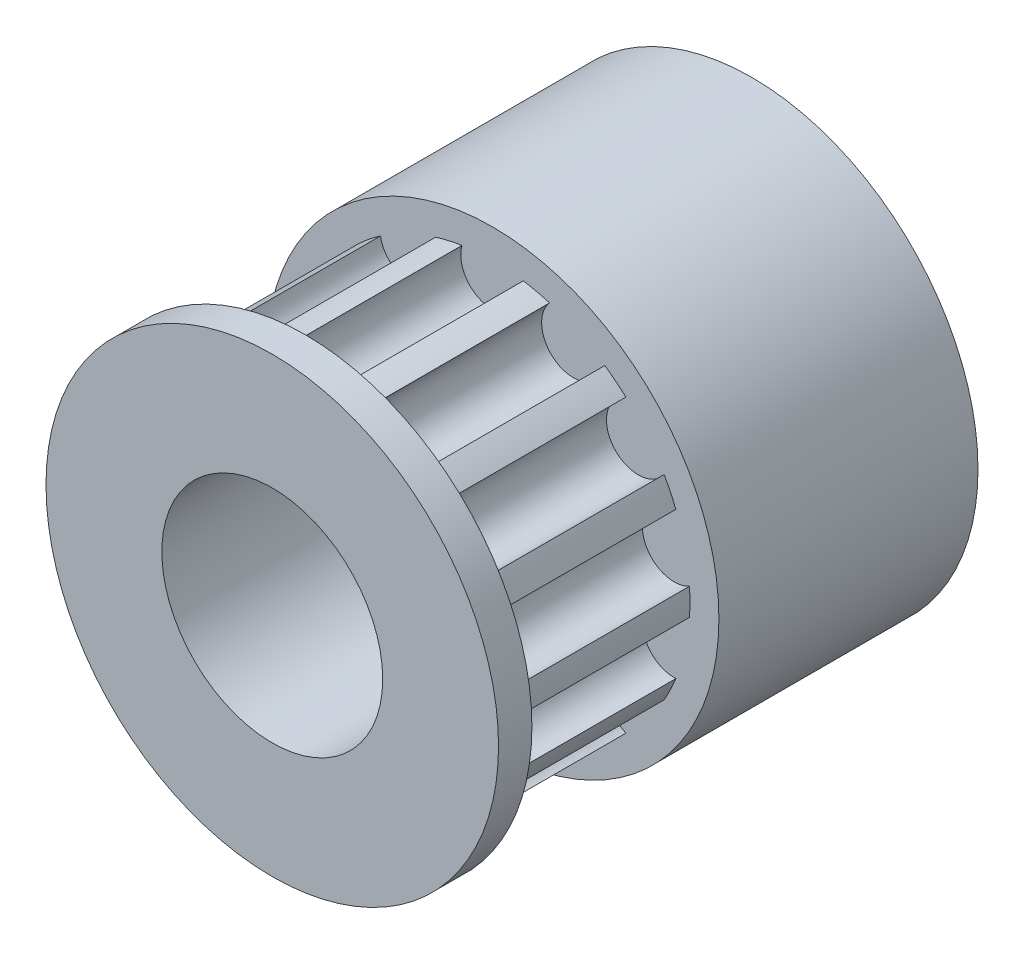
ISO-10303-21;
HEADER;
FILE_DESCRIPTION(('STEP AP214'),'2;1');
FILE_NAME('part.step','',(''),(''),'','','');
FILE_SCHEMA(('AUTOMOTIVE_DESIGN { 1 0 10303 214 1 1 1 1 }'));
ENDSEC;
DATA;
#1=APPLICATION_CONTEXT('core data for automotive mechanical design processes');
#2=APPLICATION_PROTOCOL_DEFINITION('international standard','automotive_design',2000,#1);
#3=PRODUCT_CONTEXT('',#1,'mechanical');
#4=PRODUCT('Part','Part','',(#3));
#5=PRODUCT_RELATED_PRODUCT_CATEGORY('part','',(#4));
#6=PRODUCT_DEFINITION_FORMATION('','',#4);
#7=PRODUCT_DEFINITION_CONTEXT('part definition',#1,'design');
#8=PRODUCT_DEFINITION('design','',#6,#7);
#9=PRODUCT_DEFINITION_SHAPE('','',#8);
#10=(LENGTH_UNIT() NAMED_UNIT(*) SI_UNIT(.MILLI.,.METRE.));
#11=(NAMED_UNIT(*) PLANE_ANGLE_UNIT() SI_UNIT($,.RADIAN.));
#12=(NAMED_UNIT(*) SI_UNIT($,.STERADIAN.) SOLID_ANGLE_UNIT());
#13=UNCERTAINTY_MEASURE_WITH_UNIT(LENGTH_MEASURE(1.E-05),#10,'distance_accuracy_value','');
#14=(GEOMETRIC_REPRESENTATION_CONTEXT(3) GLOBAL_UNCERTAINTY_ASSIGNED_CONTEXT((#13)) GLOBAL_UNIT_ASSIGNED_CONTEXT((#10,
#11,#12)) REPRESENTATION_CONTEXT('',''));
#15=CARTESIAN_POINT('',(0.,0.,0.));
#16=DIRECTION('',(0.,0.,1.));
#17=DIRECTION('',(1.,0.,0.));
#18=AXIS2_PLACEMENT_3D('',#15,#16,#17);
#19=CARTESIAN_POINT('',(0.,0.,0.));
#20=DIRECTION('',(0.,0.,1.));
#21=DIRECTION('',(1.,0.,0.));
#22=AXIS2_PLACEMENT_3D('',#19,#20,#21);
#23=CYLINDRICAL_SURFACE('',#22,3.40712276511129);
#24=DIRECTION('',(0.,0.,-1.));
#25=VECTOR('',#24,1.);
#26=CARTESIAN_POINT('',(0.983226332800047,3.26216975570355,0.876259982452928));
#27=LINE('',#26,#25);
#28=CARTESIAN_POINT('',(0.983226332800176,3.26216975570369,-0.576062561708139));
#29=VERTEX_POINT('',#28);
#30=CARTESIAN_POINT('',(0.983226332800047,3.26216975570355,-3.8052544946655));
#31=VERTEX_POINT('',#30);
#32=EDGE_CURVE('E364',#29,#31,#27,.T.);
#33=ORIENTED_EDGE('',*,*,#32,.T.);
#34=CARTESIAN_POINT('',(0.,0.,-3.8052544946655));
#35=DIRECTION('',(0.,0.,1.));
#36=DIRECTION('',(1.,0.,0.));
#37=AXIS2_PLACEMENT_3D('',#34,#35,#36);
#38=CIRCLE('',#37,3.40712276511129);
#39=CARTESIAN_POINT('',(0.529546095285646,3.36571930937596,-3.8052544946655));
#40=VERTEX_POINT('',#39);
#41=EDGE_CURVE('E333',#31,#40,#38,.T.);
#42=ORIENTED_EDGE('',*,*,#41,.T.);
#43=DIRECTION('',(0.,0.,-1.));
#44=VECTOR('',#43,1.);
#45=CARTESIAN_POINT('',(0.529546095285646,3.36571930937596,0.876259982452928));
#46=LINE('',#45,#44);
#47=CARTESIAN_POINT('',(0.529546095285646,3.36571930937596,-0.576062561708139));
#48=VERTEX_POINT('',#47);
#49=EDGE_CURVE('E259',#48,#40,#46,.T.);
#50=ORIENTED_EDGE('',*,*,#49,.F.);
#51=CARTESIAN_POINT('',(0.,0.,-0.576062561708139));
#52=DIRECTION('',(0.,0.,1.));
#53=DIRECTION('',(1.,0.,0.));
#54=AXIS2_PLACEMENT_3D('',#51,#52,#53);
#55=CIRCLE('',#54,3.40712276511129);
#56=EDGE_CURVE('E496',#29,#48,#55,.T.);
#57=ORIENTED_EDGE('',*,*,#56,.F.);
#58=EDGE_LOOP('',(#33,#42,#50,#57));
#59=FACE_BOUND('',#58,.T.);
#60=ADVANCED_FACE('F37',(#59),#23,.T.);
#61=DIRECTION('',(0.,0.,-1.));
#62=VECTOR('',#61,1.);
#63=CARTESIAN_POINT('',(1.93743542474386,2.80264687598813,0.876259982452928));
#64=LINE('',#63,#62);
#65=CARTESIAN_POINT('',(1.93743542474386,2.80264687598813,-0.576062561708139));
#66=VERTEX_POINT('',#65);
#67=CARTESIAN_POINT('',(1.93743542474386,2.80264687598813,-3.8052544946655));
#68=VERTEX_POINT('',#67);
#69=EDGE_CURVE('E350',#66,#68,#64,.T.);
#70=ORIENTED_EDGE('',*,*,#69,.F.);
#71=CARTESIAN_POINT('',(2.30125872719575,2.51250747402768,-0.576062561708139));
#72=VERTEX_POINT('',#71);
#73=EDGE_CURVE('E495',#72,#66,#55,.T.);
#74=ORIENTED_EDGE('',*,*,#73,.F.);
#75=DIRECTION('',(0.,0.,-1.));
#76=VECTOR('',#75,1.);
#77=CARTESIAN_POINT('',(2.30125872719557,2.51250747402761,0.876259982452928));
#78=LINE('',#77,#76);
#79=CARTESIAN_POINT('',(2.30125872719557,2.51250747402761,-3.8052544946655));
#80=VERTEX_POINT('',#79);
#81=EDGE_CURVE('E353',#72,#80,#78,.T.);
#82=ORIENTED_EDGE('',*,*,#81,.T.);
#83=EDGE_CURVE('E45',#80,#68,#38,.T.);
#84=ORIENTED_EDGE('',*,*,#83,.T.);
#85=EDGE_LOOP('',(#70,#74,#82,#84));
#86=FACE_BOUND('',#85,.T.);
#87=ADVANCED_FACE('F348',(#86),#23,.T.);
#88=DIRECTION('',(0.,0.,-1.));
#89=VECTOR('',#88,1.);
#90=CARTESIAN_POINT('',(2.9615919072454,1.6844758566026,0.876259982452928));
#91=LINE('',#90,#89);
#92=CARTESIAN_POINT('',(2.9615919072454,1.6844758566026,-0.576062561708139));
#93=VERTEX_POINT('',#92);
#94=CARTESIAN_POINT('',(2.9615919072454,1.6844758566026,-3.8052544946655));
#95=VERTEX_POINT('',#94);
#96=EDGE_CURVE('E368',#93,#95,#91,.T.);
#97=ORIENTED_EDGE('',*,*,#96,.F.);
#98=CARTESIAN_POINT('',(3.16349860758406,1.26521227323848,-0.576062561708139));
#99=VERTEX_POINT('',#98);
#100=EDGE_CURVE('E258',#99,#93,#55,.T.);
#101=ORIENTED_EDGE('',*,*,#100,.F.);
#102=DIRECTION('',(0.,0.,-1.));
#103=VECTOR('',#102,1.);
#104=CARTESIAN_POINT('',(3.16349860758387,1.26521227323849,0.876259982452928));
#105=LINE('',#104,#103);
#106=CARTESIAN_POINT('',(3.16349860758387,1.26521227323849,-3.8052544946655));
#107=VERTEX_POINT('',#106);
#108=EDGE_CURVE('E378',#99,#107,#105,.T.);
#109=ORIENTED_EDGE('',*,*,#108,.T.);
#110=EDGE_CURVE('E11',#107,#95,#38,.T.);
#111=ORIENTED_EDGE('',*,*,#110,.T.);
#112=EDGE_LOOP('',(#97,#101,#109,#111));
#113=FACE_BOUND('',#112,.T.);
#114=ADVANCED_FACE('F493',(#113),#23,.T.);
#115=DIRECTION('',(0.,0.,-1.));
#116=VECTOR('',#115,1.);
#117=CARTESIAN_POINT('',(3.39916879097584,0.232673735076269,0.876259982452928));
#118=LINE('',#117,#116);
#119=CARTESIAN_POINT('',(3.39916879097584,0.232673735076269,-0.576062561708139));
#120=VERTEX_POINT('',#119);
#121=CARTESIAN_POINT('',(3.39916879097584,0.232673735076269,-3.8052544946655));
#122=VERTEX_POINT('',#121);
#123=EDGE_CURVE('E375',#120,#122,#118,.T.);
#124=ORIENTED_EDGE('',*,*,#123,.F.);
#125=CARTESIAN_POINT('',(3.39916879097603,-0.232673735075839,-0.576062561708139));
#126=VERTEX_POINT('',#125);
#127=EDGE_CURVE('E253',#126,#120,#55,.T.);
#128=ORIENTED_EDGE('',*,*,#127,.F.);
#129=DIRECTION('',(0.,0.,-1.));
#130=VECTOR('',#129,1.);
#131=CARTESIAN_POINT('',(3.39916879097586,-0.232673735075745,0.876259982452928));
#132=LINE('',#131,#130);
#133=CARTESIAN_POINT('',(3.39916879097586,-0.232673735075745,-3.8052544946655));
#134=VERTEX_POINT('',#133);
#135=EDGE_CURVE('E388',#126,#134,#132,.T.);
#136=ORIENTED_EDGE('',*,*,#135,.T.);
#137=EDGE_CURVE('E40',#134,#122,#38,.T.);
#138=ORIENTED_EDGE('',*,*,#137,.T.);
#139=EDGE_LOOP('',(#124,#128,#136,#138));
#140=FACE_BOUND('',#139,.T.);
#141=ADVANCED_FACE('F763',(#140),#23,.T.);
#142=DIRECTION('',(0.,0.,-1.));
#143=VECTOR('',#142,1.);
#144=CARTESIAN_POINT('',(3.16349860758408,-1.26521227323801,0.876259982452928));
#145=LINE('',#144,#143);
#146=CARTESIAN_POINT('',(3.16349860758408,-1.26521227323801,-0.576062561708139));
#147=VERTEX_POINT('',#146);
#148=CARTESIAN_POINT('',(3.16349860758408,-1.26521227323801,-3.8052544946655));
#149=VERTEX_POINT('',#148);
#150=EDGE_CURVE('E384',#147,#149,#145,.T.);
#151=ORIENTED_EDGE('',*,*,#150,.F.);
#152=CARTESIAN_POINT('',(2.96159190724576,-1.68447585660229,-0.576062561708139));
#153=VERTEX_POINT('',#152);
#154=EDGE_CURVE('E256',#153,#147,#55,.T.);
#155=ORIENTED_EDGE('',*,*,#154,.F.);
#156=DIRECTION('',(0.,0.,-1.));
#157=VECTOR('',#156,1.);
#158=CARTESIAN_POINT('',(2.96159190724564,-1.68447585660214,0.876259982452928));
#159=LINE('',#158,#157);
#160=CARTESIAN_POINT('',(2.96159190724564,-1.68447585660214,-3.8052544946655));
#161=VERTEX_POINT('',#160);
#162=EDGE_CURVE('E396',#153,#161,#159,.T.);
#163=ORIENTED_EDGE('',*,*,#162,.T.);
#164=EDGE_CURVE('E280',#161,#149,#38,.T.);
#165=ORIENTED_EDGE('',*,*,#164,.T.);
#166=EDGE_LOOP('',(#151,#155,#163,#165));
#167=FACE_BOUND('',#166,.T.);
#168=ADVANCED_FACE('F484',(#167),#23,.T.);
#169=DIRECTION('',(0.,0.,-1.));
#170=VECTOR('',#169,1.);
#171=CARTESIAN_POINT('',(2.30125872719597,-2.51250747402727,0.876259982452928));
#172=LINE('',#171,#170);
#173=CARTESIAN_POINT('',(2.30125872719597,-2.51250747402727,-0.576062561708139));
#174=VERTEX_POINT('',#173);
#175=CARTESIAN_POINT('',(2.30125872719597,-2.51250747402727,-3.8052544946655));
#176=VERTEX_POINT('',#175);
#177=EDGE_CURVE('E392',#174,#176,#172,.T.);
#178=ORIENTED_EDGE('',*,*,#177,.F.);
#179=CARTESIAN_POINT('',(1.93743542474432,-2.80264687598802,-0.576062561708139));
#180=VERTEX_POINT('',#179);
#181=EDGE_CURVE('E480',#180,#174,#55,.T.);
#182=ORIENTED_EDGE('',*,*,#181,.F.);
#183=DIRECTION('',(0.,0.,-1.));
#184=VECTOR('',#183,1.);
#185=CARTESIAN_POINT('',(1.93743542474429,-2.80264687598782,0.876259982452928));
#186=LINE('',#185,#184);
#187=CARTESIAN_POINT('',(1.93743542474429,-2.80264687598782,-3.8052544946655));
#188=VERTEX_POINT('',#187);
#189=EDGE_CURVE('E404',#180,#188,#186,.T.);
#190=ORIENTED_EDGE('',*,*,#189,.T.);
#191=EDGE_CURVE('E286',#188,#176,#38,.T.);
#192=ORIENTED_EDGE('',*,*,#191,.T.);
#193=EDGE_LOOP('',(#178,#182,#190,#192));
#194=FACE_BOUND('',#193,.T.);
#195=ADVANCED_FACE('F779',(#194),#23,.T.);
#196=DIRECTION('',(0.,0.,-1.));
#197=VECTOR('',#196,1.);
#198=CARTESIAN_POINT('',(0.983226332800554,-3.26216975570341,0.876259982452928));
#199=LINE('',#198,#197);
#200=CARTESIAN_POINT('',(0.983226332800554,-3.26216975570341,-0.576062561708139));
#201=VERTEX_POINT('',#200);
#202=CARTESIAN_POINT('',(0.983226332800554,-3.26216975570341,-3.8052544946655));
#203=VERTEX_POINT('',#202);
#204=EDGE_CURVE('E400',#201,#203,#199,.T.);
#205=ORIENTED_EDGE('',*,*,#204,.F.);
#206=CARTESIAN_POINT('',(0.529546095286109,-3.36571930937605,-0.576062561708139));
#207=VERTEX_POINT('',#206);
#208=EDGE_CURVE('E478',#207,#201,#55,.T.);
#209=ORIENTED_EDGE('',*,*,#208,.F.);
#210=DIRECTION('',(0.,0.,-1.));
#211=VECTOR('',#210,1.);
#212=CARTESIAN_POINT('',(0.529546095286161,-3.36571930937587,0.876259982452928));
#213=LINE('',#212,#211);
#214=CARTESIAN_POINT('',(0.529546095286161,-3.36571930937587,-3.8052544946655));
#215=VERTEX_POINT('',#214);
#216=EDGE_CURVE('E413',#207,#215,#213,.T.);
#217=ORIENTED_EDGE('',*,*,#216,.T.);
#218=EDGE_CURVE('E292',#215,#203,#38,.T.);
#219=ORIENTED_EDGE('',*,*,#218,.T.);
#220=EDGE_LOOP('',(#205,#209,#217,#219));
#221=FACE_BOUND('',#220,.T.);
#222=ADVANCED_FACE('F788',(#221),#23,.T.);
#223=DIRECTION('',(0.,0.,-1.));
#224=VECTOR('',#223,1.);
#225=CARTESIAN_POINT('',(-0.529546095285645,-3.36571930937596,0.876259982452928));
#226=LINE('',#225,#224);
#227=CARTESIAN_POINT('',(-0.529546095285645,-3.36571930937596,-0.576062561708139));
#228=VERTEX_POINT('',#227);
#229=CARTESIAN_POINT('',(-0.529546095285645,-3.36571930937596,-3.8052544946655));
#230=VERTEX_POINT('',#229);
#231=EDGE_CURVE('E409',#228,#230,#226,.T.);
#232=ORIENTED_EDGE('',*,*,#231,.F.);
#233=CARTESIAN_POINT('',(-0.983226332800176,-3.26216975570369,-0.576062561708139));
#234=VERTEX_POINT('',#233);
#235=EDGE_CURVE('E252',#234,#228,#55,.T.);
#236=ORIENTED_EDGE('',*,*,#235,.F.);
#237=DIRECTION('',(0.,0.,-1.));
#238=VECTOR('',#237,1.);
#239=CARTESIAN_POINT('',(-0.983226332800047,-3.26216975570355,0.876259982452928));
#240=LINE('',#239,#238);
#241=CARTESIAN_POINT('',(-0.983226332800047,-3.26216975570355,-3.8052544946655));
#242=VERTEX_POINT('',#241);
#243=EDGE_CURVE('E422',#234,#242,#240,.T.);
#244=ORIENTED_EDGE('',*,*,#243,.T.);
#245=EDGE_CURVE('E298',#242,#230,#38,.T.);
#246=ORIENTED_EDGE('',*,*,#245,.T.);
#247=EDGE_LOOP('',(#232,#236,#244,#246));
#248=FACE_BOUND('',#247,.T.);
#249=ADVANCED_FACE('F476',(#248),#23,.T.);
#250=DIRECTION('',(0.,0.,-1.));
#251=VECTOR('',#250,1.);
#252=CARTESIAN_POINT('',(-1.93743542474386,-2.80264687598813,0.876259982452928));
#253=LINE('',#252,#251);
#254=CARTESIAN_POINT('',(-1.93743542474386,-2.80264687598813,-0.576062561708139));
#255=VERTEX_POINT('',#254);
#256=CARTESIAN_POINT('',(-1.93743542474386,-2.80264687598813,-3.8052544946655));
#257=VERTEX_POINT('',#256);
#258=EDGE_CURVE('E418',#255,#257,#253,.T.);
#259=ORIENTED_EDGE('',*,*,#258,.F.);
#260=CARTESIAN_POINT('',(-2.30125872719575,-2.51250747402768,-0.576062561708139));
#261=VERTEX_POINT('',#260);
#262=EDGE_CURVE('E249',#261,#255,#55,.T.);
#263=ORIENTED_EDGE('',*,*,#262,.F.);
#264=DIRECTION('',(0.,0.,-1.));
#265=VECTOR('',#264,1.);
#266=CARTESIAN_POINT('',(-2.30125872719557,-2.51250747402761,0.876259982452928));
#267=LINE('',#266,#265);
#268=CARTESIAN_POINT('',(-2.30125872719557,-2.51250747402761,-3.8052544946655));
#269=VERTEX_POINT('',#268);
#270=EDGE_CURVE('E227',#261,#269,#267,.T.);
#271=ORIENTED_EDGE('',*,*,#270,.T.);
#272=EDGE_CURVE('E304',#269,#257,#38,.T.);
#273=ORIENTED_EDGE('',*,*,#272,.T.);
#274=EDGE_LOOP('',(#259,#263,#271,#273));
#275=FACE_BOUND('',#274,.T.);
#276=ADVANCED_FACE('F471',(#275),#23,.T.);
#277=DIRECTION('',(0.,0.,-1.));
#278=VECTOR('',#277,1.);
#279=CARTESIAN_POINT('',(-2.9615919072454,-1.6844758566026,0.876259982452928));
#280=LINE('',#279,#278);
#281=CARTESIAN_POINT('',(-2.9615919072454,-1.6844758566026,-0.576062561708139));
#282=VERTEX_POINT('',#281);
#283=CARTESIAN_POINT('',(-2.9615919072454,-1.6844758566026,-3.8052544946655));
#284=VERTEX_POINT('',#283);
#285=EDGE_CURVE('E224',#282,#284,#280,.T.);
#286=ORIENTED_EDGE('',*,*,#285,.F.);
#287=CARTESIAN_POINT('',(-3.16349860758406,-1.26521227323848,-0.576062561708139));
#288=VERTEX_POINT('',#287);
#289=EDGE_CURVE('E239',#288,#282,#55,.T.);
#290=ORIENTED_EDGE('',*,*,#289,.F.);
#291=DIRECTION('',(0.,0.,-1.));
#292=VECTOR('',#291,1.);
#293=CARTESIAN_POINT('',(-3.16349860758387,-1.26521227323849,0.876259982452928));
#294=LINE('',#293,#292);
#295=CARTESIAN_POINT('',(-3.16349860758387,-1.26521227323849,-3.8052544946655));
#296=VERTEX_POINT('',#295);
#297=EDGE_CURVE('E466',#288,#296,#294,.T.);
#298=ORIENTED_EDGE('',*,*,#297,.T.);
#299=EDGE_CURVE('E241',#296,#284,#38,.T.);
#300=ORIENTED_EDGE('',*,*,#299,.T.);
#301=EDGE_LOOP('',(#286,#290,#298,#300));
#302=FACE_BOUND('',#301,.T.);
#303=ADVANCED_FACE('F237',(#302),#23,.T.);
#304=DIRECTION('',(0.,0.,-1.));
#305=VECTOR('',#304,1.);
#306=CARTESIAN_POINT('',(-3.39916879097584,-0.23267373507627,0.876259982452928));
#307=LINE('',#306,#305);
#308=CARTESIAN_POINT('',(-3.39916879097584,-0.23267373507627,-0.576062561708139));
#309=VERTEX_POINT('',#308);
#310=CARTESIAN_POINT('',(-3.39916879097584,-0.23267373507627,-3.8052544946655));
#311=VERTEX_POINT('',#310);
#312=EDGE_CURVE('E232',#309,#311,#307,.T.);
#313=ORIENTED_EDGE('',*,*,#312,.F.);
#314=CARTESIAN_POINT('',(-3.39916879097603,0.232673735075872,-0.576062561708139));
#315=VERTEX_POINT('',#314);
#316=EDGE_CURVE('E248',#315,#309,#55,.T.);
#317=ORIENTED_EDGE('',*,*,#316,.F.);
#318=DIRECTION('',(0.,0.,-1.));
#319=VECTOR('',#318,1.);
#320=CARTESIAN_POINT('',(-3.39916879097581,0.232673735075753,0.876259982452928));
#321=LINE('',#320,#319);
#322=CARTESIAN_POINT('',(-3.39916879097581,0.232673735075753,-3.8052544946655));
#323=VERTEX_POINT('',#322);
#324=EDGE_CURVE('E458',#315,#323,#321,.T.);
#325=ORIENTED_EDGE('',*,*,#324,.T.);
#326=EDGE_CURVE('E313',#323,#311,#38,.T.);
#327=ORIENTED_EDGE('',*,*,#326,.T.);
#328=EDGE_LOOP('',(#313,#317,#325,#327));
#329=FACE_BOUND('',#328,.T.);
#330=ADVANCED_FACE('F514',(#329),#23,.T.);
#331=DIRECTION('',(0.,0.,-1.));
#332=VECTOR('',#331,1.);
#333=CARTESIAN_POINT('',(-3.16349860758407,1.26521227323798,0.876259982452928));
#334=LINE('',#333,#332);
#335=CARTESIAN_POINT('',(-3.16349860758407,1.26521227323798,-0.576062561708139));
#336=VERTEX_POINT('',#335);
#337=CARTESIAN_POINT('',(-3.16349860758407,1.26521227323798,-3.8052544946655));
#338=VERTEX_POINT('',#337);
#339=EDGE_CURVE('E461',#336,#338,#334,.T.);
#340=ORIENTED_EDGE('',*,*,#339,.F.);
#341=CARTESIAN_POINT('',(-2.9615919072458,1.68447585660221,-0.576062561708139));
#342=VERTEX_POINT('',#341);
#343=EDGE_CURVE('E251',#342,#336,#55,.T.);
#344=ORIENTED_EDGE('',*,*,#343,.F.);
#345=DIRECTION('',(0.,0.,-1.));
#346=VECTOR('',#345,1.);
#347=CARTESIAN_POINT('',(-2.96159190724566,1.68447585660213,0.876259982452928));
#348=LINE('',#347,#346);
#349=CARTESIAN_POINT('',(-2.96159190724566,1.68447585660213,-3.8052544946655));
#350=VERTEX_POINT('',#349);
#351=EDGE_CURVE('E449',#342,#350,#348,.T.);
#352=ORIENTED_EDGE('',*,*,#351,.T.);
#353=EDGE_CURVE('E315',#350,#338,#38,.T.);
#354=ORIENTED_EDGE('',*,*,#353,.T.);
#355=EDGE_LOOP('',(#340,#344,#352,#354));
#356=FACE_BOUND('',#355,.T.);
#357=ADVANCED_FACE('F508',(#356),#23,.T.);
#358=DIRECTION('',(0.,0.,-1.));
#359=VECTOR('',#358,1.);
#360=CARTESIAN_POINT('',(-2.30125872719598,2.51250747402725,0.876259982452928));
#361=LINE('',#360,#359);
#362=CARTESIAN_POINT('',(-2.30125872719598,2.51250747402725,-0.576062561708139));
#363=VERTEX_POINT('',#362);
#364=CARTESIAN_POINT('',(-2.30125872719598,2.51250747402725,-3.8052544946655));
#365=VERTEX_POINT('',#364);
#366=EDGE_CURVE('E450',#363,#365,#361,.T.);
#367=ORIENTED_EDGE('',*,*,#366,.F.);
#368=CARTESIAN_POINT('',(-1.93743542474432,2.80264687598802,-0.576062561708139));
#369=VERTEX_POINT('',#368);
#370=EDGE_CURVE('E501',#369,#363,#55,.T.);
#371=ORIENTED_EDGE('',*,*,#370,.F.);
#372=DIRECTION('',(0.,0.,-1.));
#373=VECTOR('',#372,1.);
#374=CARTESIAN_POINT('',(-1.93743542474429,2.80264687598782,0.876259982452928));
#375=LINE('',#374,#373);
#376=CARTESIAN_POINT('',(-1.93743542474429,2.80264687598782,-3.8052544946655));
#377=VERTEX_POINT('',#376);
#378=EDGE_CURVE('E439',#369,#377,#375,.T.);
#379=ORIENTED_EDGE('',*,*,#378,.T.);
#380=EDGE_CURVE('E321',#377,#365,#38,.T.);
#381=ORIENTED_EDGE('',*,*,#380,.T.);
#382=EDGE_LOOP('',(#367,#371,#379,#381));
#383=FACE_BOUND('',#382,.T.);
#384=ADVANCED_FACE('F520',(#383),#23,.T.);
#385=DIRECTION('',(0.,0.,-1.));
#386=VECTOR('',#385,1.);
#387=CARTESIAN_POINT('',(-0.983226332800554,3.26216975570341,0.876259982452928));
#388=LINE('',#387,#386);
#389=CARTESIAN_POINT('',(-0.983226332800554,3.26216975570341,-0.576062561708139));
#390=VERTEX_POINT('',#389);
#391=CARTESIAN_POINT('',(-0.983226332800554,3.26216975570341,-3.8052544946655));
#392=VERTEX_POINT('',#391);
#393=EDGE_CURVE('E443',#390,#392,#388,.T.);
#394=ORIENTED_EDGE('',*,*,#393,.F.);
#395=CARTESIAN_POINT('',(-0.529546095286108,3.36571930937605,-0.576062561708139));
#396=VERTEX_POINT('',#395);
#397=EDGE_CURVE('E498',#396,#390,#55,.T.);
#398=ORIENTED_EDGE('',*,*,#397,.F.);
#399=DIRECTION('',(0.,0.,-1.));
#400=VECTOR('',#399,1.);
#401=CARTESIAN_POINT('',(-0.529546095286161,3.36571930937587,0.876259982452928));
#402=LINE('',#401,#400);
#403=CARTESIAN_POINT('',(-0.529546095286161,3.36571930937587,-3.8052544946655));
#404=VERTEX_POINT('',#403);
#405=EDGE_CURVE('E430',#396,#404,#402,.T.);
#406=ORIENTED_EDGE('',*,*,#405,.T.);
#407=EDGE_CURVE('E327',#404,#392,#38,.T.);
#408=ORIENTED_EDGE('',*,*,#407,.T.);
#409=EDGE_LOOP('',(#394,#398,#406,#408));
#410=FACE_BOUND('',#409,.T.);
#411=ADVANCED_FACE('F522',(#410),#23,.T.);
#412=CARTESIAN_POINT('',(0.,3.90712276511129,-3.8052544946655));
#413=DIRECTION('',(0.,0.,-1.));
#414=DIRECTION('',(-1.,0.,0.));
#415=AXIS2_PLACEMENT_3D('',#412,#413,#414);
#416=PLANE('',#415);
#417=ORIENTED_EDGE('',*,*,#110,.F.);
#418=CARTESIAN_POINT('',(3.13646278062228,0.715877162344871,-3.8052544946655));
#419=DIRECTION('',(0.,0.,1.));
#420=DIRECTION('',(1.,0.,0.));
#421=AXIS2_PLACEMENT_3D('',#418,#419,#420);
#422=CIRCLE('',#421,0.550000000000004);
#423=EDGE_CURVE('E381',#107,#122,#422,.T.);
#424=ORIENTED_EDGE('',*,*,#423,.T.);
#425=ORIENTED_EDGE('',*,*,#137,.F.);
#426=CARTESIAN_POINT('',(3.13646278062239,-0.715877162344395,-3.8052544946655));
#427=DIRECTION('',(0.,0.,1.));
#428=DIRECTION('',(1.,0.,0.));
#429=AXIS2_PLACEMENT_3D('',#426,#427,#428);
#430=CIRCLE('',#429,0.550000000000004);
#431=EDGE_CURVE('E390',#134,#149,#430,.T.);
#432=ORIENTED_EDGE('',*,*,#431,.T.);
#433=ORIENTED_EDGE('',*,*,#164,.F.);
#434=CARTESIAN_POINT('',(2.51524786072858,-2.00584323537412,-3.8052544946655));
#435=DIRECTION('',(0.,0.,1.));
#436=DIRECTION('',(1.,0.,0.));
#437=AXIS2_PLACEMENT_3D('',#434,#435,#436);
#438=CIRCLE('',#437,0.550000000000004);
#439=EDGE_CURVE('E398',#161,#176,#438,.T.);
#440=ORIENTED_EDGE('',*,*,#439,.T.);
#441=ORIENTED_EDGE('',*,*,#191,.F.);
#442=CARTESIAN_POINT('',(1.39585725452682,-2.8985274555851,-3.8052544946655));
#443=DIRECTION('',(0.,0.,1.));
#444=DIRECTION('',(1.,0.,0.));
#445=AXIS2_PLACEMENT_3D('',#442,#443,#444);
#446=CIRCLE('',#445,0.550000000000004);
#447=EDGE_CURVE('E406',#188,#203,#446,.T.);
#448=ORIENTED_EDGE('',*,*,#447,.T.);
#449=ORIENTED_EDGE('',*,*,#218,.F.);
#450=CARTESIAN_POINT('',(2.44325694806251E-13,-3.21712276511106,-3.8052544946655));
#451=DIRECTION('',(0.,0.,1.));
#452=DIRECTION('',(1.,0.,0.));
#453=AXIS2_PLACEMENT_3D('',#450,#451,#452);
#454=CIRCLE('',#453,0.550000000000004);
#455=EDGE_CURVE('E415',#215,#230,#454,.T.);
#456=ORIENTED_EDGE('',*,*,#455,.T.);
#457=ORIENTED_EDGE('',*,*,#245,.F.);
#458=CARTESIAN_POINT('',(-1.39585725452638,-2.89852745558531,-3.8052544946655));
#459=DIRECTION('',(0.,0.,1.));
#460=DIRECTION('',(1.,0.,0.));
#461=AXIS2_PLACEMENT_3D('',#458,#459,#460);
#462=CIRCLE('',#461,0.550000000000004);
#463=EDGE_CURVE('E424',#242,#257,#462,.T.);
#464=ORIENTED_EDGE('',*,*,#463,.T.);
#465=ORIENTED_EDGE('',*,*,#272,.F.);
#466=CARTESIAN_POINT('',(-2.51524786072827,-2.00584323537451,-3.8052544946655));
#467=DIRECTION('',(0.,0.,1.));
#468=DIRECTION('',(1.,0.,0.));
#469=AXIS2_PLACEMENT_3D('',#466,#467,#468);
#470=CIRCLE('',#469,0.550000000000004);
#471=EDGE_CURVE('E231',#269,#284,#470,.T.);
#472=ORIENTED_EDGE('',*,*,#471,.T.);
#473=ORIENTED_EDGE('',*,*,#299,.F.);
#474=CARTESIAN_POINT('',(-3.13646278062228,-0.715877162344871,-3.8052544946655));
#475=DIRECTION('',(0.,0.,1.));
#476=DIRECTION('',(1.,0.,0.));
#477=AXIS2_PLACEMENT_3D('',#474,#475,#476);
#478=CIRCLE('',#477,0.550000000000004);
#479=EDGE_CURVE('E463',#296,#311,#478,.T.);
#480=ORIENTED_EDGE('',*,*,#479,.T.);
#481=ORIENTED_EDGE('',*,*,#326,.F.);
#482=CARTESIAN_POINT('',(-3.13646278062239,0.715877162344395,-3.8052544946655));
#483=DIRECTION('',(0.,0.,1.));
#484=DIRECTION('',(1.,0.,0.));
#485=AXIS2_PLACEMENT_3D('',#482,#483,#484);
#486=CIRCLE('',#485,0.549999999999974);
#487=EDGE_CURVE('E455',#323,#338,#486,.T.);
#488=ORIENTED_EDGE('',*,*,#487,.T.);
#489=ORIENTED_EDGE('',*,*,#353,.F.);
#490=CARTESIAN_POINT('',(-2.51524786072858,2.00584323537412,-3.8052544946655));
#491=DIRECTION('',(0.,0.,1.));
#492=DIRECTION('',(1.,0.,0.));
#493=AXIS2_PLACEMENT_3D('',#490,#491,#492);
#494=CIRCLE('',#493,0.550000000000004);
#495=EDGE_CURVE('E446',#350,#365,#494,.T.);
#496=ORIENTED_EDGE('',*,*,#495,.T.);
#497=ORIENTED_EDGE('',*,*,#380,.F.);
#498=CARTESIAN_POINT('',(-1.39585725452682,2.8985274555851,-3.8052544946655));
#499=DIRECTION('',(0.,0.,1.));
#500=DIRECTION('',(1.,0.,0.));
#501=AXIS2_PLACEMENT_3D('',#498,#499,#500);
#502=CIRCLE('',#501,0.550000000000004);
#503=EDGE_CURVE('E436',#377,#392,#502,.T.);
#504=ORIENTED_EDGE('',*,*,#503,.T.);
#505=ORIENTED_EDGE('',*,*,#407,.F.);
#506=CARTESIAN_POINT('',(-2.43931710896575E-13,3.21712276511106,-3.8052544946655));
#507=DIRECTION('',(0.,0.,1.));
#508=DIRECTION('',(1.,0.,0.));
#509=AXIS2_PLACEMENT_3D('',#506,#507,#508);
#510=CIRCLE('',#509,0.550000000000004);
#511=EDGE_CURVE('E428',#404,#40,#510,.T.);
#512=ORIENTED_EDGE('',*,*,#511,.T.);
#513=ORIENTED_EDGE('',*,*,#41,.F.);
#514=CARTESIAN_POINT('',(1.39585725452638,2.89852745558531,-3.8052544946655));
#515=DIRECTION('',(0.,0.,1.));
#516=DIRECTION('',(1.,0.,0.));
#517=AXIS2_PLACEMENT_3D('',#514,#515,#516);
#518=CIRCLE('',#517,0.550000000000004);
#519=EDGE_CURVE('E360',#31,#68,#518,.T.);
#520=ORIENTED_EDGE('',*,*,#519,.T.);
#521=ORIENTED_EDGE('',*,*,#83,.F.);
#522=CARTESIAN_POINT('',(2.51524786072827,2.0058432353745,-3.8052544946655));
#523=DIRECTION('',(0.,0.,1.));
#524=DIRECTION('',(1.,0.,0.));
#525=AXIS2_PLACEMENT_3D('',#522,#523,#524);
#526=CIRCLE('',#525,0.550000000000004);
#527=EDGE_CURVE('E359',#80,#95,#526,.T.);
#528=ORIENTED_EDGE('',*,*,#527,.T.);
#529=EDGE_LOOP('',(#417,#424,#425,#432,#433,#440,#441,#448,#449,#456,#457,#464,#465,#472,#473,
#480,#481,#488,#489,#496,#497,#504,#505,#512,#513,#520,#521,#528));
#530=FACE_BOUND('',#529,.T.);
#531=CARTESIAN_POINT('',(0.,0.,-3.8052544946655));
#532=DIRECTION('',(0.,0.,1.));
#533=DIRECTION('',(1.,0.,0.));
#534=AXIS2_PLACEMENT_3D('',#531,#532,#533);
#535=CIRCLE('',#534,3.90712276511129);
#536=CARTESIAN_POINT('',(3.90712276511129,0.,-3.8052544946655));
#537=VERTEX_POINT('',#536);
#538=EDGE_CURVE('E275',#537,#537,#535,.T.);
#539=ORIENTED_EDGE('',*,*,#538,.T.);
#540=EDGE_LOOP('',(#539));
#541=FACE_BOUND('',#540,.T.);
#542=ADVANCED_FACE('F358',(#530,#541),#416,.F.);
#543=CARTESIAN_POINT('',(0.,0.,0.));
#544=DIRECTION('',(0.,0.,1.));
#545=DIRECTION('',(1.,0.,0.));
#546=AXIS2_PLACEMENT_3D('',#543,#544,#545);
#547=CYLINDRICAL_SURFACE('',#546,3.90712276511129);
#548=ORIENTED_EDGE('',*,*,#538,.F.);
#549=EDGE_LOOP('',(#548));
#550=FACE_BOUND('',#549,.T.);
#551=CARTESIAN_POINT('',(0.,0.,-8.2791747495785));
#552=DIRECTION('',(0.,0.,1.));
#553=DIRECTION('',(1.,0.,0.));
#554=AXIS2_PLACEMENT_3D('',#551,#552,#553);
#555=CIRCLE('',#554,3.90712276511129);
#556=CARTESIAN_POINT('',(3.90712276511129,0.,-8.2791747495785));
#557=VERTEX_POINT('',#556);
#558=EDGE_CURVE('E273',#557,#557,#555,.T.);
#559=ORIENTED_EDGE('',*,*,#558,.T.);
#560=EDGE_LOOP('',(#559));
#561=FACE_BOUND('',#560,.T.);
#562=ADVANCED_FACE('F531',(#550,#561),#547,.T.);
#563=CARTESIAN_POINT('',(0.,3.75366666903964,-8.2791747495785));
#564=DIRECTION('',(0.,0.,1.));
#565=DIRECTION('',(1.,0.,0.));
#566=AXIS2_PLACEMENT_3D('',#563,#564,#565);
#567=PLANE('',#566);
#568=ORIENTED_EDGE('',*,*,#558,.F.);
#569=EDGE_LOOP('',(#568));
#570=FACE_BOUND('',#569,.T.);
#571=CARTESIAN_POINT('',(0.,0.,-8.2791747495785));
#572=DIRECTION('',(0.,0.,1.));
#573=DIRECTION('',(1.,0.,0.));
#574=AXIS2_PLACEMENT_3D('',#571,#572,#573);
#575=CIRCLE('',#574,1.90712276511129);
#576=CARTESIAN_POINT('',(1.90712276511129,0.,-8.2791747495785));
#577=VERTEX_POINT('',#576);
#578=EDGE_CURVE('E270',#577,#577,#575,.T.);
#579=ORIENTED_EDGE('',*,*,#578,.T.);
#580=EDGE_LOOP('',(#579));
#581=FACE_BOUND('',#580,.T.);
#582=ADVANCED_FACE('F589',(#570,#581),#567,.F.);
#583=CARTESIAN_POINT('',(0.,0.,0.));
#584=DIRECTION('',(0.,0.,1.));
#585=DIRECTION('',(1.,0.,0.));
#586=AXIS2_PLACEMENT_3D('',#583,#584,#585);
#587=CYLINDRICAL_SURFACE('',#586,1.90712276511129);
#588=ORIENTED_EDGE('',*,*,#578,.F.);
#589=EDGE_LOOP('',(#588));
#590=FACE_BOUND('',#589,.T.);
#591=CARTESIAN_POINT('',(0.,0.,0.));
#592=DIRECTION('',(0.,0.,1.));
#593=DIRECTION('',(1.,0.,0.));
#594=AXIS2_PLACEMENT_3D('',#591,#592,#593);
#595=CIRCLE('',#594,1.90712276511129);
#596=CARTESIAN_POINT('',(1.90712276511129,0.,0.));
#597=VERTEX_POINT('',#596);
#598=EDGE_CURVE('E267',#597,#597,#595,.T.);
#599=ORIENTED_EDGE('',*,*,#598,.T.);
#600=EDGE_LOOP('',(#599));
#601=FACE_BOUND('',#600,.T.);
#602=ADVANCED_FACE('F585',(#590,#601),#587,.F.);
#603=CARTESIAN_POINT('',(0.,3.90712276511129,0.));
#604=DIRECTION('',(0.,0.,-1.));
#605=DIRECTION('',(-1.,0.,0.));
#606=AXIS2_PLACEMENT_3D('',#603,#604,#605);
#607=PLANE('',#606);
#608=ORIENTED_EDGE('',*,*,#598,.F.);
#609=EDGE_LOOP('',(#608));
#610=FACE_BOUND('',#609,.T.);
#611=CARTESIAN_POINT('',(0.,0.,0.));
#612=DIRECTION('',(0.,0.,1.));
#613=DIRECTION('',(1.,0.,0.));
#614=AXIS2_PLACEMENT_3D('',#611,#612,#613);
#615=CIRCLE('',#614,3.90712276511129);
#616=CARTESIAN_POINT('',(3.90712276511129,0.,0.));
#617=VERTEX_POINT('',#616);
#618=EDGE_CURVE('E264',#617,#617,#615,.T.);
#619=ORIENTED_EDGE('',*,*,#618,.T.);
#620=EDGE_LOOP('',(#619));
#621=FACE_BOUND('',#620,.T.);
#622=ADVANCED_FACE('F581',(#610,#621),#607,.F.);
#623=CARTESIAN_POINT('',(0.,0.,0.));
#624=DIRECTION('',(0.,0.,1.));
#625=DIRECTION('',(1.,0.,0.));
#626=AXIS2_PLACEMENT_3D('',#623,#624,#625);
#627=CYLINDRICAL_SURFACE('',#626,3.90712276511129);
#628=ORIENTED_EDGE('',*,*,#618,.F.);
#629=EDGE_LOOP('',(#628));
#630=FACE_BOUND('',#629,.T.);
#631=CARTESIAN_POINT('',(0.,0.,-0.576062561708139));
#632=DIRECTION('',(0.,0.,1.));
#633=DIRECTION('',(1.,0.,0.));
#634=AXIS2_PLACEMENT_3D('',#631,#632,#633);
#635=CIRCLE('',#634,3.90712276511129);
#636=CARTESIAN_POINT('',(3.90712276511129,0.,-0.576062561708139));
#637=VERTEX_POINT('',#636);
#638=EDGE_CURVE('E261',#637,#637,#635,.T.);
#639=ORIENTED_EDGE('',*,*,#638,.T.);
#640=EDGE_LOOP('',(#639));
#641=FACE_BOUND('',#640,.T.);
#642=ADVANCED_FACE('F577',(#630,#641),#627,.T.);
#643=CARTESIAN_POINT('',(0.,3.90712276511129,-0.576062561708139));
#644=DIRECTION('',(0.,0.,1.));
#645=DIRECTION('',(1.,0.,0.));
#646=AXIS2_PLACEMENT_3D('',#643,#644,#645);
#647=PLANE('',#646);
#648=ORIENTED_EDGE('',*,*,#638,.F.);
#649=EDGE_LOOP('',(#648));
#650=FACE_BOUND('',#649,.T.);
#651=ORIENTED_EDGE('',*,*,#127,.T.);
#652=CARTESIAN_POINT('',(3.13646278062228,0.715877162344871,-0.576062561708139));
#653=DIRECTION('',(0.,0.,1.));
#654=DIRECTION('',(1.,0.,0.));
#655=AXIS2_PLACEMENT_3D('',#652,#653,#654);
#656=CIRCLE('',#655,0.550000000000004);
#657=EDGE_CURVE('E382',#99,#120,#656,.T.);
#658=ORIENTED_EDGE('',*,*,#657,.F.);
#659=ORIENTED_EDGE('',*,*,#100,.T.);
#660=CARTESIAN_POINT('',(2.51524786072827,2.0058432353745,-0.576062561708139));
#661=DIRECTION('',(0.,0.,1.));
#662=DIRECTION('',(1.,0.,0.));
#663=AXIS2_PLACEMENT_3D('',#660,#661,#662);
#664=CIRCLE('',#663,0.550000000000004);
#665=EDGE_CURVE('E373',#72,#93,#664,.T.);
#666=ORIENTED_EDGE('',*,*,#665,.F.);
#667=ORIENTED_EDGE('',*,*,#73,.T.);
#668=CARTESIAN_POINT('',(1.39585725452638,2.89852745558531,-0.576062561708139));
#669=DIRECTION('',(0.,0.,1.));
#670=DIRECTION('',(1.,0.,0.));
#671=AXIS2_PLACEMENT_3D('',#668,#669,#670);
#672=CIRCLE('',#671,0.550000000000004);
#673=EDGE_CURVE('E365',#29,#66,#672,.T.);
#674=ORIENTED_EDGE('',*,*,#673,.F.);
#675=ORIENTED_EDGE('',*,*,#56,.T.);
#676=CARTESIAN_POINT('',(-2.43931710896575E-13,3.21712276511106,-0.576062561708139));
#677=DIRECTION('',(0.,0.,1.));
#678=DIRECTION('',(1.,0.,0.));
#679=AXIS2_PLACEMENT_3D('',#676,#677,#678);
#680=CIRCLE('',#679,0.550000000000004);
#681=EDGE_CURVE('E257',#396,#48,#680,.T.);
#682=ORIENTED_EDGE('',*,*,#681,.F.);
#683=ORIENTED_EDGE('',*,*,#397,.T.);
#684=CARTESIAN_POINT('',(-1.39585725452682,2.8985274555851,-0.576062561708139));
#685=DIRECTION('',(0.,0.,1.));
#686=DIRECTION('',(1.,0.,0.));
#687=AXIS2_PLACEMENT_3D('',#684,#685,#686);
#688=CIRCLE('',#687,0.550000000000004);
#689=EDGE_CURVE('E440',#369,#390,#688,.T.);
#690=ORIENTED_EDGE('',*,*,#689,.F.);
#691=ORIENTED_EDGE('',*,*,#370,.T.);
#692=CARTESIAN_POINT('',(-2.51524786072858,2.00584323537412,-0.576062561708139));
#693=DIRECTION('',(0.,0.,1.));
#694=DIRECTION('',(1.,0.,0.));
#695=AXIS2_PLACEMENT_3D('',#692,#693,#694);
#696=CIRCLE('',#695,0.550000000000004);
#697=EDGE_CURVE('E445',#342,#363,#696,.T.);
#698=ORIENTED_EDGE('',*,*,#697,.F.);
#699=ORIENTED_EDGE('',*,*,#343,.T.);
#700=CARTESIAN_POINT('',(-3.13646278062239,0.715877162344395,-0.576062561708139));
#701=DIRECTION('',(0.,0.,1.));
#702=DIRECTION('',(1.,0.,0.));
#703=AXIS2_PLACEMENT_3D('',#700,#701,#702);
#704=CIRCLE('',#703,0.549999999999974);
#705=EDGE_CURVE('E454',#315,#336,#704,.T.);
#706=ORIENTED_EDGE('',*,*,#705,.F.);
#707=ORIENTED_EDGE('',*,*,#316,.T.);
#708=CARTESIAN_POINT('',(-3.13646278062228,-0.715877162344871,-0.576062561708139));
#709=DIRECTION('',(0.,0.,1.));
#710=DIRECTION('',(1.,0.,0.));
#711=AXIS2_PLACEMENT_3D('',#708,#709,#710);
#712=CIRCLE('',#711,0.550000000000004);
#713=EDGE_CURVE('E246',#288,#309,#712,.T.);
#714=ORIENTED_EDGE('',*,*,#713,.F.);
#715=ORIENTED_EDGE('',*,*,#289,.T.);
#716=CARTESIAN_POINT('',(-2.51524786072827,-2.00584323537451,-0.576062561708139));
#717=DIRECTION('',(0.,0.,1.));
#718=DIRECTION('',(1.,0.,0.));
#719=AXIS2_PLACEMENT_3D('',#716,#717,#718);
#720=CIRCLE('',#719,0.550000000000004);
#721=EDGE_CURVE('E221',#261,#282,#720,.T.);
#722=ORIENTED_EDGE('',*,*,#721,.F.);
#723=ORIENTED_EDGE('',*,*,#262,.T.);
#724=CARTESIAN_POINT('',(-1.39585725452638,-2.89852745558531,-0.576062561708139));
#725=DIRECTION('',(0.,0.,1.));
#726=DIRECTION('',(1.,0.,0.));
#727=AXIS2_PLACEMENT_3D('',#724,#725,#726);
#728=CIRCLE('',#727,0.550000000000004);
#729=EDGE_CURVE('E242',#234,#255,#728,.T.);
#730=ORIENTED_EDGE('',*,*,#729,.F.);
#731=ORIENTED_EDGE('',*,*,#235,.T.);
#732=CARTESIAN_POINT('',(2.44325694806251E-13,-3.21712276511106,-0.576062561708139));
#733=DIRECTION('',(0.,0.,1.));
#734=DIRECTION('',(1.,0.,0.));
#735=AXIS2_PLACEMENT_3D('',#732,#733,#734);
#736=CIRCLE('',#735,0.550000000000004);
#737=EDGE_CURVE('E416',#207,#228,#736,.T.);
#738=ORIENTED_EDGE('',*,*,#737,.F.);
#739=ORIENTED_EDGE('',*,*,#208,.T.);
#740=CARTESIAN_POINT('',(1.39585725452682,-2.8985274555851,-0.576062561708139));
#741=DIRECTION('',(0.,0.,1.));
#742=DIRECTION('',(1.,0.,0.));
#743=AXIS2_PLACEMENT_3D('',#740,#741,#742);
#744=CIRCLE('',#743,0.550000000000004);
#745=EDGE_CURVE('E407',#180,#201,#744,.T.);
#746=ORIENTED_EDGE('',*,*,#745,.F.);
#747=ORIENTED_EDGE('',*,*,#181,.T.);
#748=CARTESIAN_POINT('',(2.51524786072858,-2.00584323537412,-0.576062561708139));
#749=DIRECTION('',(0.,0.,1.));
#750=DIRECTION('',(1.,0.,0.));
#751=AXIS2_PLACEMENT_3D('',#748,#749,#750);
#752=CIRCLE('',#751,0.550000000000004);
#753=EDGE_CURVE('E58',#153,#174,#752,.T.);
#754=ORIENTED_EDGE('',*,*,#753,.F.);
#755=ORIENTED_EDGE('',*,*,#154,.T.);
#756=CARTESIAN_POINT('',(3.13646278062239,-0.715877162344395,-0.576062561708139));
#757=DIRECTION('',(0.,0.,1.));
#758=DIRECTION('',(1.,0.,0.));
#759=AXIS2_PLACEMENT_3D('',#756,#757,#758);
#760=CIRCLE('',#759,0.550000000000004);
#761=EDGE_CURVE('E52',#126,#147,#760,.T.);
#762=ORIENTED_EDGE('',*,*,#761,.F.);
#763=EDGE_LOOP('',(#651,#658,#659,#666,#667,#674,#675,#682,#683,#690,#691,#698,#699,#706,#707,
#714,#715,#722,#723,#730,#731,#738,#739,#746,#747,#754,#755,#762));
#764=FACE_BOUND('',#763,.T.);
#765=ADVANCED_FACE('F244',(#650,#764),#647,.F.);
#766=CARTESIAN_POINT('',(-2.43931710896575E-13,3.21712276511106,0.876259982452928));
#767=DIRECTION('',(0.,0.,-1.));
#768=DIRECTION('',(-1.,0.,0.));
#769=AXIS2_PLACEMENT_3D('',#766,#767,#768);
#770=CYLINDRICAL_SURFACE('',#769,0.550000000000004);
#771=ORIENTED_EDGE('',*,*,#681,.T.);
#772=ORIENTED_EDGE('',*,*,#49,.T.);
#773=ORIENTED_EDGE('',*,*,#511,.F.);
#774=ORIENTED_EDGE('',*,*,#405,.F.);
#775=EDGE_LOOP('',(#771,#772,#773,#774));
#776=FACE_BOUND('',#775,.T.);
#777=ADVANCED_FACE('F544',(#776),#770,.F.);
#778=CARTESIAN_POINT('',(-1.39585725452682,2.8985274555851,0.876259982452928));
#779=DIRECTION('',(0.,0.,-1.));
#780=DIRECTION('',(-1.,0.,0.));
#781=AXIS2_PLACEMENT_3D('',#778,#779,#780);
#782=CYLINDRICAL_SURFACE('',#781,0.550000000000004);
#783=ORIENTED_EDGE('',*,*,#689,.T.);
#784=ORIENTED_EDGE('',*,*,#393,.T.);
#785=ORIENTED_EDGE('',*,*,#503,.F.);
#786=ORIENTED_EDGE('',*,*,#378,.F.);
#787=EDGE_LOOP('',(#783,#784,#785,#786));
#788=FACE_BOUND('',#787,.T.);
#789=ADVANCED_FACE('F533',(#788),#782,.F.);
#790=CARTESIAN_POINT('',(-2.51524786072858,2.00584323537412,0.876259982452928));
#791=DIRECTION('',(0.,0.,-1.));
#792=DIRECTION('',(-1.,0.,0.));
#793=AXIS2_PLACEMENT_3D('',#790,#791,#792);
#794=CYLINDRICAL_SURFACE('',#793,0.550000000000004);
#795=ORIENTED_EDGE('',*,*,#697,.T.);
#796=ORIENTED_EDGE('',*,*,#366,.T.);
#797=ORIENTED_EDGE('',*,*,#495,.F.);
#798=ORIENTED_EDGE('',*,*,#351,.F.);
#799=EDGE_LOOP('',(#795,#796,#797,#798));
#800=FACE_BOUND('',#799,.T.);
#801=ADVANCED_FACE('F536',(#800),#794,.F.);
#802=CARTESIAN_POINT('',(-3.13646278062239,0.715877162344395,0.876259982452928));
#803=DIRECTION('',(0.,0.,-1.));
#804=DIRECTION('',(-1.,0.,0.));
#805=AXIS2_PLACEMENT_3D('',#802,#803,#804);
#806=CYLINDRICAL_SURFACE('',#805,0.549999999999974);
#807=ORIENTED_EDGE('',*,*,#705,.T.);
#808=ORIENTED_EDGE('',*,*,#339,.T.);
#809=ORIENTED_EDGE('',*,*,#487,.F.);
#810=ORIENTED_EDGE('',*,*,#324,.F.);
#811=EDGE_LOOP('',(#807,#808,#809,#810));
#812=FACE_BOUND('',#811,.T.);
#813=ADVANCED_FACE('F510',(#812),#806,.F.);
#814=CARTESIAN_POINT('',(-3.13646278062228,-0.715877162344871,0.876259982452928));
#815=DIRECTION('',(0.,0.,-1.));
#816=DIRECTION('',(-1.,0.,0.));
#817=AXIS2_PLACEMENT_3D('',#814,#815,#816);
#818=CYLINDRICAL_SURFACE('',#817,0.550000000000004);
#819=ORIENTED_EDGE('',*,*,#713,.T.);
#820=ORIENTED_EDGE('',*,*,#312,.T.);
#821=ORIENTED_EDGE('',*,*,#479,.F.);
#822=ORIENTED_EDGE('',*,*,#297,.F.);
#823=EDGE_LOOP('',(#819,#820,#821,#822));
#824=FACE_BOUND('',#823,.T.);
#825=ADVANCED_FACE('F512',(#824),#818,.F.);
#826=CARTESIAN_POINT('',(-2.51524786072827,-2.00584323537451,0.876259982452928));
#827=DIRECTION('',(0.,0.,-1.));
#828=DIRECTION('',(-1.,0.,0.));
#829=AXIS2_PLACEMENT_3D('',#826,#827,#828);
#830=CYLINDRICAL_SURFACE('',#829,0.550000000000004);
#831=ORIENTED_EDGE('',*,*,#721,.T.);
#832=ORIENTED_EDGE('',*,*,#285,.T.);
#833=ORIENTED_EDGE('',*,*,#471,.F.);
#834=ORIENTED_EDGE('',*,*,#270,.F.);
#835=EDGE_LOOP('',(#831,#832,#833,#834));
#836=FACE_BOUND('',#835,.T.);
#837=ADVANCED_FACE('F223',(#836),#830,.F.);
#838=CARTESIAN_POINT('',(-1.39585725452638,-2.89852745558531,0.876259982452928));
#839=DIRECTION('',(0.,0.,-1.));
#840=DIRECTION('',(-1.,0.,0.));
#841=AXIS2_PLACEMENT_3D('',#838,#839,#840);
#842=CYLINDRICAL_SURFACE('',#841,0.550000000000004);
#843=ORIENTED_EDGE('',*,*,#729,.T.);
#844=ORIENTED_EDGE('',*,*,#258,.T.);
#845=ORIENTED_EDGE('',*,*,#463,.F.);
#846=ORIENTED_EDGE('',*,*,#243,.F.);
#847=EDGE_LOOP('',(#843,#844,#845,#846));
#848=FACE_BOUND('',#847,.T.);
#849=ADVANCED_FACE('F474',(#848),#842,.F.);
#850=CARTESIAN_POINT('',(2.44325694806251E-13,-3.21712276511106,0.876259982452928));
#851=DIRECTION('',(0.,0.,-1.));
#852=DIRECTION('',(-1.,0.,0.));
#853=AXIS2_PLACEMENT_3D('',#850,#851,#852);
#854=CYLINDRICAL_SURFACE('',#853,0.550000000000004);
#855=ORIENTED_EDGE('',*,*,#737,.T.);
#856=ORIENTED_EDGE('',*,*,#231,.T.);
#857=ORIENTED_EDGE('',*,*,#455,.F.);
#858=ORIENTED_EDGE('',*,*,#216,.F.);
#859=EDGE_LOOP('',(#855,#856,#857,#858));
#860=FACE_BOUND('',#859,.T.);
#861=ADVANCED_FACE('F566',(#860),#854,.F.);
#862=CARTESIAN_POINT('',(1.39585725452682,-2.8985274555851,0.876259982452928));
#863=DIRECTION('',(0.,0.,-1.));
#864=DIRECTION('',(-1.,0.,0.));
#865=AXIS2_PLACEMENT_3D('',#862,#863,#864);
#866=CYLINDRICAL_SURFACE('',#865,0.550000000000004);
#867=ORIENTED_EDGE('',*,*,#745,.T.);
#868=ORIENTED_EDGE('',*,*,#204,.T.);
#869=ORIENTED_EDGE('',*,*,#447,.F.);
#870=ORIENTED_EDGE('',*,*,#189,.F.);
#871=EDGE_LOOP('',(#867,#868,#869,#870));
#872=FACE_BOUND('',#871,.T.);
#873=ADVANCED_FACE('F562',(#872),#866,.F.);
#874=CARTESIAN_POINT('',(2.51524786072858,-2.00584323537412,0.876259982452928));
#875=DIRECTION('',(0.,0.,-1.));
#876=DIRECTION('',(-1.,0.,0.));
#877=AXIS2_PLACEMENT_3D('',#874,#875,#876);
#878=CYLINDRICAL_SURFACE('',#877,0.550000000000004);
#879=ORIENTED_EDGE('',*,*,#753,.T.);
#880=ORIENTED_EDGE('',*,*,#177,.T.);
#881=ORIENTED_EDGE('',*,*,#439,.F.);
#882=ORIENTED_EDGE('',*,*,#162,.F.);
#883=EDGE_LOOP('',(#879,#880,#881,#882));
#884=FACE_BOUND('',#883,.T.);
#885=ADVANCED_FACE('F559',(#884),#878,.F.);
#886=CARTESIAN_POINT('',(3.13646278062239,-0.715877162344395,0.876259982452928));
#887=DIRECTION('',(0.,0.,-1.));
#888=DIRECTION('',(-1.,0.,0.));
#889=AXIS2_PLACEMENT_3D('',#886,#887,#888);
#890=CYLINDRICAL_SURFACE('',#889,0.550000000000004);
#891=ORIENTED_EDGE('',*,*,#761,.T.);
#892=ORIENTED_EDGE('',*,*,#150,.T.);
#893=ORIENTED_EDGE('',*,*,#431,.F.);
#894=ORIENTED_EDGE('',*,*,#135,.F.);
#895=EDGE_LOOP('',(#891,#892,#893,#894));
#896=FACE_BOUND('',#895,.T.);
#897=ADVANCED_FACE('F486',(#896),#890,.F.);
#898=CARTESIAN_POINT('',(3.13646278062228,0.715877162344871,0.876259982452928));
#899=DIRECTION('',(0.,0.,-1.));
#900=DIRECTION('',(-1.,0.,0.));
#901=AXIS2_PLACEMENT_3D('',#898,#899,#900);
#902=CYLINDRICAL_SURFACE('',#901,0.550000000000004);
#903=ORIENTED_EDGE('',*,*,#657,.T.);
#904=ORIENTED_EDGE('',*,*,#123,.T.);
#905=ORIENTED_EDGE('',*,*,#423,.F.);
#906=ORIENTED_EDGE('',*,*,#108,.F.);
#907=EDGE_LOOP('',(#903,#904,#905,#906));
#908=FACE_BOUND('',#907,.T.);
#909=ADVANCED_FACE('F489',(#908),#902,.F.);
#910=CARTESIAN_POINT('',(2.51524786072827,2.0058432353745,0.876259982452928));
#911=DIRECTION('',(0.,0.,-1.));
#912=DIRECTION('',(-1.,0.,0.));
#913=AXIS2_PLACEMENT_3D('',#910,#911,#912);
#914=CYLINDRICAL_SURFACE('',#913,0.550000000000004);
#915=ORIENTED_EDGE('',*,*,#665,.T.);
#916=ORIENTED_EDGE('',*,*,#96,.T.);
#917=ORIENTED_EDGE('',*,*,#527,.F.);
#918=ORIENTED_EDGE('',*,*,#81,.F.);
#919=EDGE_LOOP('',(#915,#916,#917,#918));
#920=FACE_BOUND('',#919,.T.);
#921=ADVANCED_FACE('F551',(#920),#914,.F.);
#922=CARTESIAN_POINT('',(1.39585725452638,2.89852745558531,0.876259982452928));
#923=DIRECTION('',(0.,0.,-1.));
#924=DIRECTION('',(-1.,0.,0.));
#925=AXIS2_PLACEMENT_3D('',#922,#923,#924);
#926=CYLINDRICAL_SURFACE('',#925,0.550000000000004);
#927=ORIENTED_EDGE('',*,*,#673,.T.);
#928=ORIENTED_EDGE('',*,*,#69,.T.);
#929=ORIENTED_EDGE('',*,*,#519,.F.);
#930=ORIENTED_EDGE('',*,*,#32,.F.);
#931=EDGE_LOOP('',(#927,#928,#929,#930));
#932=FACE_BOUND('',#931,.T.);
#933=ADVANCED_FACE('F548',(#932),#926,.F.);
#934=CLOSED_SHELL('',(#60,#87,#114,#141,#168,#195,#222,#249,#276,#303,#330,#357,#384,#411,#542,
#562,#582,#602,#622,#642,#765,#777,#789,#801,#813,#825,#837,#849,#861,#873,#885,#897,#909,#921,#933));
#935=MANIFOLD_SOLID_BREP('B2',#934);
#936=ADVANCED_BREP_SHAPE_REPRESENTATION('',(#18,#935),#14);
#937=SHAPE_DEFINITION_REPRESENTATION(#9,#936);
ENDSEC;
END-ISO-10303-21;
